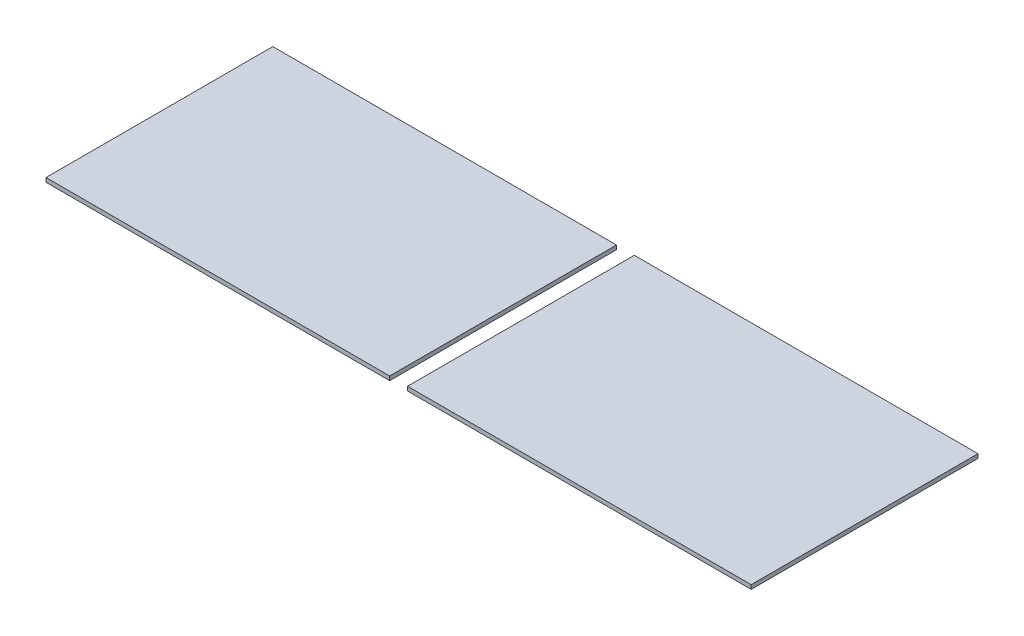
ISO-10303-21;
HEADER;
FILE_DESCRIPTION(('STEP AP214'),'2;1');
FILE_NAME('part.step','',(''),(''),'','','');
FILE_SCHEMA(('AUTOMOTIVE_DESIGN { 1 0 10303 214 1 1 1 1 }'));
ENDSEC;
DATA;
#1=APPLICATION_CONTEXT('core data for automotive mechanical design processes');
#2=APPLICATION_PROTOCOL_DEFINITION('international standard','automotive_design',2000,#1);
#3=PRODUCT_CONTEXT('',#1,'mechanical');
#4=PRODUCT('Part','Part','',(#3));
#5=PRODUCT_RELATED_PRODUCT_CATEGORY('part','',(#4));
#6=PRODUCT_DEFINITION_FORMATION('','',#4);
#7=PRODUCT_DEFINITION_CONTEXT('part definition',#1,'design');
#8=PRODUCT_DEFINITION('design','',#6,#7);
#9=PRODUCT_DEFINITION_SHAPE('','',#8);
#10=(LENGTH_UNIT() NAMED_UNIT(*) SI_UNIT(.MILLI.,.METRE.));
#11=(NAMED_UNIT(*) PLANE_ANGLE_UNIT() SI_UNIT($,.RADIAN.));
#12=(NAMED_UNIT(*) SI_UNIT($,.STERADIAN.) SOLID_ANGLE_UNIT());
#13=UNCERTAINTY_MEASURE_WITH_UNIT(LENGTH_MEASURE(1.E-05),#10,'distance_accuracy_value','');
#14=(GEOMETRIC_REPRESENTATION_CONTEXT(3) GLOBAL_UNCERTAINTY_ASSIGNED_CONTEXT((#13)) GLOBAL_UNIT_ASSIGNED_CONTEXT((#10,
#11,#12)) REPRESENTATION_CONTEXT('',''));
#15=CARTESIAN_POINT('',(0.,0.,0.));
#16=DIRECTION('',(0.,0.,1.));
#17=DIRECTION('',(1.,0.,0.));
#18=AXIS2_PLACEMENT_3D('',#15,#16,#17);
#19=CARTESIAN_POINT('',(-12.9939025009094,6.,-165.));
#20=DIRECTION('',(-1.,0.,0.));
#21=DIRECTION('',(0.,0.,-1.));
#22=AXIS2_PLACEMENT_3D('',#19,#20,#21);
#23=PLANE('',#22);
#24=DIRECTION('',(0.,0.,1.));
#25=VECTOR('',#24,1.);
#26=CARTESIAN_POINT('',(-12.9939025009094,0.,-165.));
#27=LINE('',#26,#25);
#28=CARTESIAN_POINT('',(-12.9939025009094,0.,-165.));
#29=VERTEX_POINT('',#28);
#30=CARTESIAN_POINT('',(-12.9939025009094,0.,165.));
#31=VERTEX_POINT('',#30);
#32=EDGE_CURVE('E106',#29,#31,#27,.T.);
#33=ORIENTED_EDGE('',*,*,#32,.F.);
#34=DIRECTION('',(0.,-1.,0.));
#35=VECTOR('',#34,1.);
#36=CARTESIAN_POINT('',(-12.9939025009094,6.,-165.));
#37=LINE('',#36,#35);
#38=CARTESIAN_POINT('',(-12.9939025009094,6.,-165.));
#39=VERTEX_POINT('',#38);
#40=EDGE_CURVE('E105',#39,#29,#37,.T.);
#41=ORIENTED_EDGE('',*,*,#40,.F.);
#42=DIRECTION('',(0.,0.,1.));
#43=VECTOR('',#42,1.);
#44=CARTESIAN_POINT('',(-12.9939025009094,6.,-165.));
#45=LINE('',#44,#43);
#46=CARTESIAN_POINT('',(-12.9939025009094,6.,165.));
#47=VERTEX_POINT('',#46);
#48=EDGE_CURVE('E100',#39,#47,#45,.T.);
#49=ORIENTED_EDGE('',*,*,#48,.T.);
#50=DIRECTION('',(0.,-1.,0.));
#51=VECTOR('',#50,1.);
#52=CARTESIAN_POINT('',(-12.9939025009094,6.,165.));
#53=LINE('',#52,#51);
#54=EDGE_CURVE('E12',#47,#31,#53,.T.);
#55=ORIENTED_EDGE('',*,*,#54,.T.);
#56=EDGE_LOOP('',(#33,#41,#49,#55));
#57=FACE_BOUND('',#56,.T.);
#58=ADVANCED_FACE('F43',(#57),#23,.F.);
#59=CARTESIAN_POINT('',(-12.9939025009094,6.,165.));
#60=DIRECTION('',(0.,0.,-1.));
#61=DIRECTION('',(1.,0.,0.));
#62=AXIS2_PLACEMENT_3D('',#59,#60,#61);
#63=PLANE('',#62);
#64=DIRECTION('',(-1.,0.,0.));
#65=VECTOR('',#64,1.);
#66=CARTESIAN_POINT('',(-12.9939025009094,0.,165.));
#67=LINE('',#66,#65);
#68=CARTESIAN_POINT('',(-512.993902500909,0.,165.));
#69=VERTEX_POINT('',#68);
#70=EDGE_CURVE('E108',#31,#69,#67,.T.);
#71=ORIENTED_EDGE('',*,*,#70,.F.);
#72=ORIENTED_EDGE('',*,*,#54,.F.);
#73=DIRECTION('',(-1.,0.,0.));
#74=VECTOR('',#73,1.);
#75=CARTESIAN_POINT('',(-12.9939025009094,6.,165.));
#76=LINE('',#75,#74);
#77=CARTESIAN_POINT('',(-512.993902500909,6.,165.));
#78=VERTEX_POINT('',#77);
#79=EDGE_CURVE('E84',#47,#78,#76,.T.);
#80=ORIENTED_EDGE('',*,*,#79,.T.);
#81=DIRECTION('',(0.,-1.,0.));
#82=VECTOR('',#81,1.);
#83=CARTESIAN_POINT('',(-512.993902500909,6.,165.));
#84=LINE('',#83,#82);
#85=EDGE_CURVE('E51',#78,#69,#84,.T.);
#86=ORIENTED_EDGE('',*,*,#85,.T.);
#87=EDGE_LOOP('',(#71,#72,#80,#86));
#88=FACE_BOUND('',#87,.T.);
#89=ADVANCED_FACE('F98',(#88),#63,.F.);
#90=CARTESIAN_POINT('',(-512.993902500909,6.,-165.));
#91=DIRECTION('',(1.,0.,0.));
#92=DIRECTION('',(0.,0.,1.));
#93=AXIS2_PLACEMENT_3D('',#90,#91,#92);
#94=PLANE('',#93);
#95=DIRECTION('',(0.,0.,-1.));
#96=VECTOR('',#95,1.);
#97=CARTESIAN_POINT('',(-512.993902500909,0.,-165.));
#98=LINE('',#97,#96);
#99=CARTESIAN_POINT('',(-512.993902500909,0.,-165.));
#100=VERTEX_POINT('',#99);
#101=EDGE_CURVE('E94',#69,#100,#98,.T.);
#102=ORIENTED_EDGE('',*,*,#101,.F.);
#103=ORIENTED_EDGE('',*,*,#85,.F.);
#104=DIRECTION('',(0.,0.,-1.));
#105=VECTOR('',#104,1.);
#106=CARTESIAN_POINT('',(-512.993902500909,6.,-165.));
#107=LINE('',#106,#105);
#108=CARTESIAN_POINT('',(-512.993902500909,6.,-165.));
#109=VERTEX_POINT('',#108);
#110=EDGE_CURVE('E87',#78,#109,#107,.T.);
#111=ORIENTED_EDGE('',*,*,#110,.T.);
#112=DIRECTION('',(0.,-1.,0.));
#113=VECTOR('',#112,1.);
#114=CARTESIAN_POINT('',(-512.993902500909,6.,-165.));
#115=LINE('',#114,#113);
#116=EDGE_CURVE('E97',#109,#100,#115,.T.);
#117=ORIENTED_EDGE('',*,*,#116,.T.);
#118=EDGE_LOOP('',(#102,#103,#111,#117));
#119=FACE_BOUND('',#118,.T.);
#120=ADVANCED_FACE('F93',(#119),#94,.F.);
#121=CARTESIAN_POINT('',(-12.9939025009094,6.,-165.));
#122=DIRECTION('',(0.,0.,1.));
#123=DIRECTION('',(-1.,0.,0.));
#124=AXIS2_PLACEMENT_3D('',#121,#122,#123);
#125=PLANE('',#124);
#126=DIRECTION('',(1.,0.,0.));
#127=VECTOR('',#126,1.);
#128=CARTESIAN_POINT('',(-12.9939025009094,0.,-165.));
#129=LINE('',#128,#127);
#130=EDGE_CURVE('E73',#100,#29,#129,.T.);
#131=ORIENTED_EDGE('',*,*,#130,.F.);
#132=ORIENTED_EDGE('',*,*,#116,.F.);
#133=DIRECTION('',(1.,0.,0.));
#134=VECTOR('',#133,1.);
#135=CARTESIAN_POINT('',(-12.9939025009094,6.,-165.));
#136=LINE('',#135,#134);
#137=EDGE_CURVE('E59',#109,#39,#136,.T.);
#138=ORIENTED_EDGE('',*,*,#137,.T.);
#139=ORIENTED_EDGE('',*,*,#40,.T.);
#140=EDGE_LOOP('',(#131,#132,#138,#139));
#141=FACE_BOUND('',#140,.T.);
#142=ADVANCED_FACE('F117',(#141),#125,.F.);
#143=CARTESIAN_POINT('',(0.,6.,0.));
#144=DIRECTION('',(0.,1.,0.));
#145=DIRECTION('',(0.,0.,1.));
#146=AXIS2_PLACEMENT_3D('',#143,#144,#145);
#147=PLANE('',#146);
#148=ORIENTED_EDGE('',*,*,#48,.F.);
#149=ORIENTED_EDGE('',*,*,#137,.F.);
#150=ORIENTED_EDGE('',*,*,#110,.F.);
#151=ORIENTED_EDGE('',*,*,#79,.F.);
#152=EDGE_LOOP('',(#148,#149,#150,#151));
#153=FACE_BOUND('',#152,.T.);
#154=ADVANCED_FACE('F89',(#153),#147,.T.);
#155=CARTESIAN_POINT('',(0.,0.,0.));
#156=DIRECTION('',(0.,1.,0.));
#157=DIRECTION('',(0.,0.,1.));
#158=AXIS2_PLACEMENT_3D('',#155,#156,#157);
#159=PLANE('',#158);
#160=ORIENTED_EDGE('',*,*,#32,.T.);
#161=ORIENTED_EDGE('',*,*,#70,.T.);
#162=ORIENTED_EDGE('',*,*,#101,.T.);
#163=ORIENTED_EDGE('',*,*,#130,.T.);
#164=EDGE_LOOP('',(#160,#161,#162,#163));
#165=FACE_BOUND('',#164,.T.);
#166=ADVANCED_FACE('F113',(#165),#159,.F.);
#167=CLOSED_SHELL('',(#58,#89,#120,#142,#154,#166));
#168=MANIFOLD_SOLID_BREP('B2',#167);
#169=CARTESIAN_POINT('',(12.9939025009094,6.,-165.));
#170=DIRECTION('',(1.,0.,0.));
#171=DIRECTION('',(0.,0.,-1.));
#172=AXIS2_PLACEMENT_3D('',#169,#170,#171);
#173=PLANE('',#172);
#174=DIRECTION('',(0.,0.,1.));
#175=VECTOR('',#174,1.);
#176=CARTESIAN_POINT('',(12.9939025009094,0.,-165.));
#177=LINE('',#176,#175);
#178=CARTESIAN_POINT('',(12.9939025009094,0.,-165.));
#179=VERTEX_POINT('',#178);
#180=CARTESIAN_POINT('',(12.9939025009094,0.,165.));
#181=VERTEX_POINT('',#180);
#182=EDGE_CURVE('E230',#179,#181,#177,.T.);
#183=ORIENTED_EDGE('',*,*,#182,.T.);
#184=DIRECTION('',(0.,-1.,0.));
#185=VECTOR('',#184,1.);
#186=CARTESIAN_POINT('',(12.9939025009094,6.,165.));
#187=LINE('',#186,#185);
#188=CARTESIAN_POINT('',(12.9939025009094,6.,165.));
#189=VERTEX_POINT('',#188);
#190=EDGE_CURVE('E41',#189,#181,#187,.T.);
#191=ORIENTED_EDGE('',*,*,#190,.F.);
#192=DIRECTION('',(0.,0.,1.));
#193=VECTOR('',#192,1.);
#194=CARTESIAN_POINT('',(12.9939025009094,6.,-165.));
#195=LINE('',#194,#193);
#196=CARTESIAN_POINT('',(12.9939025009094,6.,-165.));
#197=VERTEX_POINT('',#196);
#198=EDGE_CURVE('E218',#197,#189,#195,.T.);
#199=ORIENTED_EDGE('',*,*,#198,.F.);
#200=DIRECTION('',(0.,-1.,0.));
#201=VECTOR('',#200,1.);
#202=CARTESIAN_POINT('',(12.9939025009094,6.,-165.));
#203=LINE('',#202,#201);
#204=EDGE_CURVE('E226',#197,#179,#203,.T.);
#205=ORIENTED_EDGE('',*,*,#204,.T.);
#206=EDGE_LOOP('',(#183,#191,#199,#205));
#207=FACE_BOUND('',#206,.T.);
#208=ADVANCED_FACE('F167',(#207),#173,.F.);
#209=CARTESIAN_POINT('',(12.9939025009094,6.,165.));
#210=DIRECTION('',(0.,0.,-1.));
#211=DIRECTION('',(-1.,0.,0.));
#212=AXIS2_PLACEMENT_3D('',#209,#210,#211);
#213=PLANE('',#212);
#214=DIRECTION('',(1.,0.,0.));
#215=VECTOR('',#214,1.);
#216=CARTESIAN_POINT('',(12.9939025009094,0.,165.));
#217=LINE('',#216,#215);
#218=CARTESIAN_POINT('',(512.993902500909,0.,165.));
#219=VERTEX_POINT('',#218);
#220=EDGE_CURVE('E222',#181,#219,#217,.T.);
#221=ORIENTED_EDGE('',*,*,#220,.T.);
#222=DIRECTION('',(0.,-1.,0.));
#223=VECTOR('',#222,1.);
#224=CARTESIAN_POINT('',(512.993902500909,6.,165.));
#225=LINE('',#224,#223);
#226=CARTESIAN_POINT('',(512.993902500909,6.,165.));
#227=VERTEX_POINT('',#226);
#228=EDGE_CURVE('E175',#227,#219,#225,.T.);
#229=ORIENTED_EDGE('',*,*,#228,.F.);
#230=DIRECTION('',(1.,0.,0.));
#231=VECTOR('',#230,1.);
#232=CARTESIAN_POINT('',(12.9939025009094,6.,165.));
#233=LINE('',#232,#231);
#234=EDGE_CURVE('E213',#189,#227,#233,.T.);
#235=ORIENTED_EDGE('',*,*,#234,.F.);
#236=ORIENTED_EDGE('',*,*,#190,.T.);
#237=EDGE_LOOP('',(#221,#229,#235,#236));
#238=FACE_BOUND('',#237,.T.);
#239=ADVANCED_FACE('F221',(#238),#213,.F.);
#240=CARTESIAN_POINT('',(512.993902500909,6.,-165.));
#241=DIRECTION('',(-1.,0.,0.));
#242=DIRECTION('',(0.,0.,1.));
#243=AXIS2_PLACEMENT_3D('',#240,#241,#242);
#244=PLANE('',#243);
#245=DIRECTION('',(0.,0.,-1.));
#246=VECTOR('',#245,1.);
#247=CARTESIAN_POINT('',(512.993902500909,0.,-165.));
#248=LINE('',#247,#246);
#249=CARTESIAN_POINT('',(512.993902500909,0.,-165.));
#250=VERTEX_POINT('',#249);
#251=EDGE_CURVE('E200',#219,#250,#248,.T.);
#252=ORIENTED_EDGE('',*,*,#251,.T.);
#253=DIRECTION('',(0.,-1.,0.));
#254=VECTOR('',#253,1.);
#255=CARTESIAN_POINT('',(512.993902500909,6.,-165.));
#256=LINE('',#255,#254);
#257=CARTESIAN_POINT('',(512.993902500909,6.,-165.));
#258=VERTEX_POINT('',#257);
#259=EDGE_CURVE('E223',#258,#250,#256,.T.);
#260=ORIENTED_EDGE('',*,*,#259,.F.);
#261=DIRECTION('',(0.,0.,-1.));
#262=VECTOR('',#261,1.);
#263=CARTESIAN_POINT('',(512.993902500909,6.,-165.));
#264=LINE('',#263,#262);
#265=EDGE_CURVE('E216',#227,#258,#264,.T.);
#266=ORIENTED_EDGE('',*,*,#265,.F.);
#267=ORIENTED_EDGE('',*,*,#228,.T.);
#268=EDGE_LOOP('',(#252,#260,#266,#267));
#269=FACE_BOUND('',#268,.T.);
#270=ADVANCED_FACE('F224',(#269),#244,.F.);
#271=CARTESIAN_POINT('',(12.9939025009094,6.,-165.));
#272=DIRECTION('',(0.,0.,1.));
#273=DIRECTION('',(1.,0.,0.));
#274=AXIS2_PLACEMENT_3D('',#271,#272,#273);
#275=PLANE('',#274);
#276=DIRECTION('',(-1.,0.,0.));
#277=VECTOR('',#276,1.);
#278=CARTESIAN_POINT('',(12.9939025009094,0.,-165.));
#279=LINE('',#278,#277);
#280=EDGE_CURVE('E206',#250,#179,#279,.T.);
#281=ORIENTED_EDGE('',*,*,#280,.T.);
#282=ORIENTED_EDGE('',*,*,#204,.F.);
#283=DIRECTION('',(-1.,0.,0.));
#284=VECTOR('',#283,1.);
#285=CARTESIAN_POINT('',(12.9939025009094,6.,-165.));
#286=LINE('',#285,#284);
#287=EDGE_CURVE('E183',#258,#197,#286,.T.);
#288=ORIENTED_EDGE('',*,*,#287,.F.);
#289=ORIENTED_EDGE('',*,*,#259,.T.);
#290=EDGE_LOOP('',(#281,#282,#288,#289));
#291=FACE_BOUND('',#290,.T.);
#292=ADVANCED_FACE('F237',(#291),#275,.F.);
#293=CARTESIAN_POINT('',(0.,6.,0.));
#294=DIRECTION('',(0.,1.,0.));
#295=DIRECTION('',(0.,0.,1.));
#296=AXIS2_PLACEMENT_3D('',#293,#294,#295);
#297=PLANE('',#296);
#298=ORIENTED_EDGE('',*,*,#198,.T.);
#299=ORIENTED_EDGE('',*,*,#234,.T.);
#300=ORIENTED_EDGE('',*,*,#265,.T.);
#301=ORIENTED_EDGE('',*,*,#287,.T.);
#302=EDGE_LOOP('',(#298,#299,#300,#301));
#303=FACE_BOUND('',#302,.T.);
#304=ADVANCED_FACE('F214',(#303),#297,.T.);
#305=CARTESIAN_POINT('',(0.,0.,0.));
#306=DIRECTION('',(0.,1.,0.));
#307=DIRECTION('',(0.,0.,1.));
#308=AXIS2_PLACEMENT_3D('',#305,#306,#307);
#309=PLANE('',#308);
#310=ORIENTED_EDGE('',*,*,#182,.F.);
#311=ORIENTED_EDGE('',*,*,#280,.F.);
#312=ORIENTED_EDGE('',*,*,#251,.F.);
#313=ORIENTED_EDGE('',*,*,#220,.F.);
#314=EDGE_LOOP('',(#310,#311,#312,#313));
#315=FACE_BOUND('',#314,.T.);
#316=ADVANCED_FACE('F240',(#315),#309,.F.);
#317=CLOSED_SHELL('',(#208,#239,#270,#292,#304,#316));
#318=MANIFOLD_SOLID_BREP('B6',#317);
#319=ADVANCED_BREP_SHAPE_REPRESENTATION('',(#18,#168,#318),#14);
#320=SHAPE_DEFINITION_REPRESENTATION(#9,#319);
ENDSEC;
END-ISO-10303-21;
